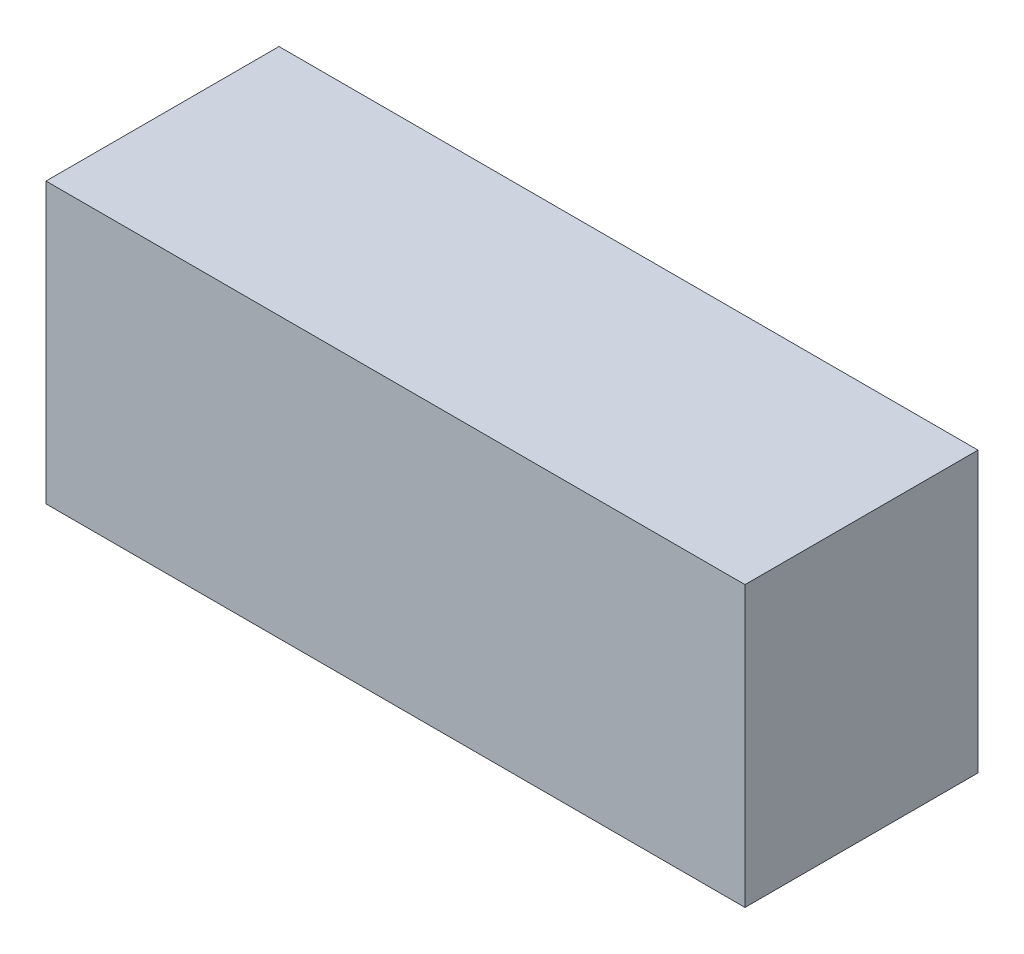
ISO-10303-21;
HEADER;
FILE_DESCRIPTION(('STEP AP214'),'2;1');
FILE_NAME('part.step','',(''),(''),'','','');
FILE_SCHEMA(('AUTOMOTIVE_DESIGN { 1 0 10303 214 1 1 1 1 }'));
ENDSEC;
DATA;
#1=APPLICATION_CONTEXT('core data for automotive mechanical design processes');
#2=APPLICATION_PROTOCOL_DEFINITION('international standard','automotive_design',2000,#1);
#3=PRODUCT_CONTEXT('',#1,'mechanical');
#4=PRODUCT('Part','Part','',(#3));
#5=PRODUCT_RELATED_PRODUCT_CATEGORY('part','',(#4));
#6=PRODUCT_DEFINITION_FORMATION('','',#4);
#7=PRODUCT_DEFINITION_CONTEXT('part definition',#1,'design');
#8=PRODUCT_DEFINITION('design','',#6,#7);
#9=PRODUCT_DEFINITION_SHAPE('','',#8);
#10=(LENGTH_UNIT() NAMED_UNIT(*) SI_UNIT(.MILLI.,.METRE.));
#11=(NAMED_UNIT(*) PLANE_ANGLE_UNIT() SI_UNIT($,.RADIAN.));
#12=(NAMED_UNIT(*) SI_UNIT($,.STERADIAN.) SOLID_ANGLE_UNIT());
#13=UNCERTAINTY_MEASURE_WITH_UNIT(LENGTH_MEASURE(1.E-05),#10,'distance_accuracy_value','');
#14=(GEOMETRIC_REPRESENTATION_CONTEXT(3) GLOBAL_UNCERTAINTY_ASSIGNED_CONTEXT((#13)) GLOBAL_UNIT_ASSIGNED_CONTEXT((#10,
#11,#12)) REPRESENTATION_CONTEXT('',''));
#15=CARTESIAN_POINT('',(0.,0.,0.));
#16=DIRECTION('',(0.,0.,1.));
#17=DIRECTION('',(1.,0.,0.));
#18=AXIS2_PLACEMENT_3D('',#15,#16,#17);
#19=CARTESIAN_POINT('',(-19.05,15.24,6.35));
#20=DIRECTION('',(1.,0.,0.));
#21=DIRECTION('',(0.,0.,-1.));
#22=AXIS2_PLACEMENT_3D('',#19,#20,#21);
#23=PLANE('',#22);
#24=DIRECTION('',(0.,0.,1.));
#25=VECTOR('',#24,1.);
#26=CARTESIAN_POINT('',(-19.05,0.,6.35));
#27=LINE('',#26,#25);
#28=CARTESIAN_POINT('',(-19.05,0.,-6.35));
#29=VERTEX_POINT('',#28);
#30=CARTESIAN_POINT('',(-19.05,0.,6.35));
#31=VERTEX_POINT('',#30);
#32=EDGE_CURVE('E98',#29,#31,#27,.T.);
#33=ORIENTED_EDGE('',*,*,#32,.T.);
#34=DIRECTION('',(0.,-1.,0.));
#35=VECTOR('',#34,1.);
#36=CARTESIAN_POINT('',(-19.05,15.24,6.35));
#37=LINE('',#36,#35);
#38=CARTESIAN_POINT('',(-19.05,15.24,6.35));
#39=VERTEX_POINT('',#38);
#40=EDGE_CURVE('E11',#39,#31,#37,.T.);
#41=ORIENTED_EDGE('',*,*,#40,.F.);
#42=DIRECTION('',(0.,0.,1.));
#43=VECTOR('',#42,1.);
#44=CARTESIAN_POINT('',(-19.05,15.24,6.35));
#45=LINE('',#44,#43);
#46=CARTESIAN_POINT('',(-19.05,15.24,-6.35));
#47=VERTEX_POINT('',#46);
#48=EDGE_CURVE('E86',#47,#39,#45,.T.);
#49=ORIENTED_EDGE('',*,*,#48,.F.);
#50=DIRECTION('',(0.,-1.,0.));
#51=VECTOR('',#50,1.);
#52=CARTESIAN_POINT('',(-19.05,15.24,-6.35));
#53=LINE('',#52,#51);
#54=EDGE_CURVE('E94',#47,#29,#53,.T.);
#55=ORIENTED_EDGE('',*,*,#54,.T.);
#56=EDGE_LOOP('',(#33,#41,#49,#55));
#57=FACE_BOUND('',#56,.T.);
#58=ADVANCED_FACE('F35',(#57),#23,.F.);
#59=CARTESIAN_POINT('',(19.05,15.24,6.35));
#60=DIRECTION('',(0.,0.,-1.));
#61=DIRECTION('',(-1.,0.,0.));
#62=AXIS2_PLACEMENT_3D('',#59,#60,#61);
#63=PLANE('',#62);
#64=DIRECTION('',(1.,0.,0.));
#65=VECTOR('',#64,1.);
#66=CARTESIAN_POINT('',(19.05,0.,6.35));
#67=LINE('',#66,#65);
#68=CARTESIAN_POINT('',(19.05,0.,6.35));
#69=VERTEX_POINT('',#68);
#70=EDGE_CURVE('E90',#31,#69,#67,.T.);
#71=ORIENTED_EDGE('',*,*,#70,.T.);
#72=DIRECTION('',(0.,-1.,0.));
#73=VECTOR('',#72,1.);
#74=CARTESIAN_POINT('',(19.05,15.24,6.35));
#75=LINE('',#74,#73);
#76=CARTESIAN_POINT('',(19.05,15.24,6.35));
#77=VERTEX_POINT('',#76);
#78=EDGE_CURVE('E43',#77,#69,#75,.T.);
#79=ORIENTED_EDGE('',*,*,#78,.F.);
#80=DIRECTION('',(1.,0.,0.));
#81=VECTOR('',#80,1.);
#82=CARTESIAN_POINT('',(19.05,15.24,6.35));
#83=LINE('',#82,#81);
#84=EDGE_CURVE('E81',#39,#77,#83,.T.);
#85=ORIENTED_EDGE('',*,*,#84,.F.);
#86=ORIENTED_EDGE('',*,*,#40,.T.);
#87=EDGE_LOOP('',(#71,#79,#85,#86));
#88=FACE_BOUND('',#87,.T.);
#89=ADVANCED_FACE('F89',(#88),#63,.F.);
#90=CARTESIAN_POINT('',(19.05,15.24,6.35));
#91=DIRECTION('',(-1.,0.,0.));
#92=DIRECTION('',(0.,0.,1.));
#93=AXIS2_PLACEMENT_3D('',#90,#91,#92);
#94=PLANE('',#93);
#95=DIRECTION('',(0.,0.,-1.));
#96=VECTOR('',#95,1.);
#97=CARTESIAN_POINT('',(19.05,0.,6.35));
#98=LINE('',#97,#96);
#99=CARTESIAN_POINT('',(19.05,0.,-6.35));
#100=VERTEX_POINT('',#99);
#101=EDGE_CURVE('E68',#69,#100,#98,.T.);
#102=ORIENTED_EDGE('',*,*,#101,.T.);
#103=DIRECTION('',(0.,-1.,0.));
#104=VECTOR('',#103,1.);
#105=CARTESIAN_POINT('',(19.05,15.24,-6.35));
#106=LINE('',#105,#104);
#107=CARTESIAN_POINT('',(19.05,15.24,-6.35));
#108=VERTEX_POINT('',#107);
#109=EDGE_CURVE('E91',#108,#100,#106,.T.);
#110=ORIENTED_EDGE('',*,*,#109,.F.);
#111=DIRECTION('',(0.,0.,-1.));
#112=VECTOR('',#111,1.);
#113=CARTESIAN_POINT('',(19.05,15.24,6.35));
#114=LINE('',#113,#112);
#115=EDGE_CURVE('E84',#77,#108,#114,.T.);
#116=ORIENTED_EDGE('',*,*,#115,.F.);
#117=ORIENTED_EDGE('',*,*,#78,.T.);
#118=EDGE_LOOP('',(#102,#110,#116,#117));
#119=FACE_BOUND('',#118,.T.);
#120=ADVANCED_FACE('F92',(#119),#94,.F.);
#121=CARTESIAN_POINT('',(19.05,15.24,-6.35));
#122=DIRECTION('',(0.,0.,1.));
#123=DIRECTION('',(1.,0.,0.));
#124=AXIS2_PLACEMENT_3D('',#121,#122,#123);
#125=PLANE('',#124);
#126=DIRECTION('',(-1.,0.,0.));
#127=VECTOR('',#126,1.);
#128=CARTESIAN_POINT('',(19.05,0.,-6.35));
#129=LINE('',#128,#127);
#130=EDGE_CURVE('E74',#100,#29,#129,.T.);
#131=ORIENTED_EDGE('',*,*,#130,.T.);
#132=ORIENTED_EDGE('',*,*,#54,.F.);
#133=DIRECTION('',(-1.,0.,0.));
#134=VECTOR('',#133,1.);
#135=CARTESIAN_POINT('',(19.05,15.24,-6.35));
#136=LINE('',#135,#134);
#137=EDGE_CURVE('E51',#108,#47,#136,.T.);
#138=ORIENTED_EDGE('',*,*,#137,.F.);
#139=ORIENTED_EDGE('',*,*,#109,.T.);
#140=EDGE_LOOP('',(#131,#132,#138,#139));
#141=FACE_BOUND('',#140,.T.);
#142=ADVANCED_FACE('F105',(#141),#125,.F.);
#143=CARTESIAN_POINT('',(0.,15.24,0.));
#144=DIRECTION('',(0.,1.,0.));
#145=DIRECTION('',(0.,0.,1.));
#146=AXIS2_PLACEMENT_3D('',#143,#144,#145);
#147=PLANE('',#146);
#148=ORIENTED_EDGE('',*,*,#48,.T.);
#149=ORIENTED_EDGE('',*,*,#84,.T.);
#150=ORIENTED_EDGE('',*,*,#115,.T.);
#151=ORIENTED_EDGE('',*,*,#137,.T.);
#152=EDGE_LOOP('',(#148,#149,#150,#151));
#153=FACE_BOUND('',#152,.T.);
#154=ADVANCED_FACE('F82',(#153),#147,.T.);
#155=CARTESIAN_POINT('',(0.,0.,0.));
#156=DIRECTION('',(0.,1.,0.));
#157=DIRECTION('',(0.,0.,1.));
#158=AXIS2_PLACEMENT_3D('',#155,#156,#157);
#159=PLANE('',#158);
#160=ORIENTED_EDGE('',*,*,#32,.F.);
#161=ORIENTED_EDGE('',*,*,#130,.F.);
#162=ORIENTED_EDGE('',*,*,#101,.F.);
#163=ORIENTED_EDGE('',*,*,#70,.F.);
#164=EDGE_LOOP('',(#160,#161,#162,#163));
#165=FACE_BOUND('',#164,.T.);
#166=ADVANCED_FACE('F108',(#165),#159,.F.);
#167=CLOSED_SHELL('',(#58,#89,#120,#142,#154,#166));
#168=MANIFOLD_SOLID_BREP('B2',#167);
#169=ADVANCED_BREP_SHAPE_REPRESENTATION('',(#18,#168),#14);
#170=SHAPE_DEFINITION_REPRESENTATION(#9,#169);
ENDSEC;
END-ISO-10303-21;
